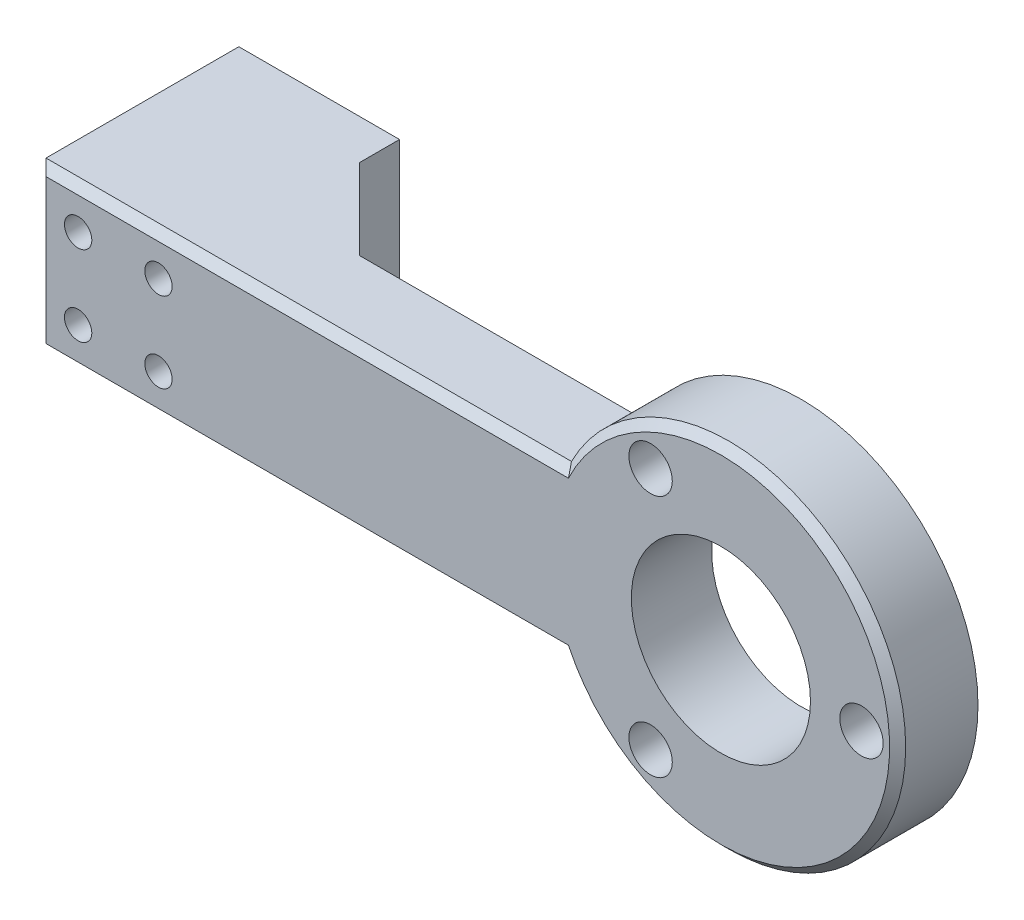
ISO-10303-21;
HEADER;
FILE_DESCRIPTION(('STEP AP214'),'2;1');
FILE_NAME('part.step','',(''),(''),'','','');
FILE_SCHEMA(('AUTOMOTIVE_DESIGN { 1 0 10303 214 1 1 1 1 }'));
ENDSEC;
DATA;
#1=APPLICATION_CONTEXT('core data for automotive mechanical design processes');
#2=APPLICATION_PROTOCOL_DEFINITION('international standard','automotive_design',2000,#1);
#3=PRODUCT_CONTEXT('',#1,'mechanical');
#4=PRODUCT('Part','Part','',(#3));
#5=PRODUCT_RELATED_PRODUCT_CATEGORY('part','',(#4));
#6=PRODUCT_DEFINITION_FORMATION('','',#4);
#7=PRODUCT_DEFINITION_CONTEXT('part definition',#1,'design');
#8=PRODUCT_DEFINITION('design','',#6,#7);
#9=PRODUCT_DEFINITION_SHAPE('','',#8);
#10=(LENGTH_UNIT() NAMED_UNIT(*) SI_UNIT(.MILLI.,.METRE.));
#11=(NAMED_UNIT(*) PLANE_ANGLE_UNIT() SI_UNIT($,.RADIAN.));
#12=(NAMED_UNIT(*) SI_UNIT($,.STERADIAN.) SOLID_ANGLE_UNIT());
#13=UNCERTAINTY_MEASURE_WITH_UNIT(LENGTH_MEASURE(1.E-05),#10,'distance_accuracy_value','');
#14=(GEOMETRIC_REPRESENTATION_CONTEXT(3) GLOBAL_UNCERTAINTY_ASSIGNED_CONTEXT((#13)) GLOBAL_UNIT_ASSIGNED_CONTEXT((#10,
#11,#12)) REPRESENTATION_CONTEXT('',''));
#15=CARTESIAN_POINT('',(0.,0.,0.));
#16=DIRECTION('',(0.,0.,1.));
#17=DIRECTION('',(1.,0.,0.));
#18=AXIS2_PLACEMENT_3D('',#15,#16,#17);
#19=CARTESIAN_POINT('',(0.,0.,0.));
#20=DIRECTION('',(0.,0.,1.));
#21=DIRECTION('',(1.,0.,0.));
#22=AXIS2_PLACEMENT_3D('',#19,#20,#21);
#23=PLANE('',#22);
#24=CARTESIAN_POINT('',(-8.74999999999982,15.1554445662278,0.));
#25=DIRECTION('',(0.,0.,1.));
#26=DIRECTION('',(1.,0.,0.));
#27=AXIS2_PLACEMENT_3D('',#24,#25,#26);
#28=CIRCLE('',#27,2.7);
#29=CARTESIAN_POINT('',(-6.04999999999981,15.1554445662278,0.));
#30=VERTEX_POINT('',#29);
#31=EDGE_CURVE('E152',#30,#30,#28,.T.);
#32=ORIENTED_EDGE('',*,*,#31,.T.);
#33=EDGE_LOOP('',(#32));
#34=FACE_BOUND('',#33,.T.);
#35=CARTESIAN_POINT('',(17.5,0.,0.));
#36=DIRECTION('',(0.,0.,1.));
#37=DIRECTION('',(1.,0.,0.));
#38=AXIS2_PLACEMENT_3D('',#35,#36,#37);
#39=CIRCLE('',#38,2.7);
#40=CARTESIAN_POINT('',(20.2,0.,0.));
#41=VERTEX_POINT('',#40);
#42=EDGE_CURVE('E162',#41,#41,#39,.T.);
#43=ORIENTED_EDGE('',*,*,#42,.T.);
#44=EDGE_LOOP('',(#43));
#45=FACE_BOUND('',#44,.T.);
#46=CARTESIAN_POINT('',(-8.74999999999982,-15.1554445662277,0.));
#47=DIRECTION('',(0.,0.,1.));
#48=DIRECTION('',(1.,0.,0.));
#49=AXIS2_PLACEMENT_3D('',#46,#47,#48);
#50=CIRCLE('',#49,2.7);
#51=CARTESIAN_POINT('',(-6.04999999999981,-15.1554445662277,0.));
#52=VERTEX_POINT('',#51);
#53=EDGE_CURVE('E168',#52,#52,#50,.T.);
#54=ORIENTED_EDGE('',*,*,#53,.T.);
#55=EDGE_LOOP('',(#54));
#56=FACE_BOUND('',#55,.T.);
#57=CARTESIAN_POINT('',(0.,0.,0.));
#58=DIRECTION('',(0.,0.,1.));
#59=DIRECTION('',(1.,0.,0.));
#60=AXIS2_PLACEMENT_3D('',#57,#58,#59);
#61=CIRCLE('',#60,11.15);
#62=CARTESIAN_POINT('',(11.15,0.,0.));
#63=VERTEX_POINT('',#62);
#64=EDGE_CURVE('E174',#63,#63,#61,.T.);
#65=ORIENTED_EDGE('',*,*,#64,.T.);
#66=EDGE_LOOP('',(#65));
#67=FACE_BOUND('',#66,.T.);
#68=DIRECTION('',(1.,0.,0.));
#69=VECTOR('',#68,1.);
#70=CARTESIAN_POINT('',(0.,-10.,0.));
#71=LINE('',#70,#69);
#72=CARTESIAN_POINT('',(-55.,-10.,0.));
#73=VERTEX_POINT('',#72);
#74=CARTESIAN_POINT('',(-19.5959179422654,-10.,0.));
#75=VERTEX_POINT('',#74);
#76=EDGE_CURVE('E148',#73,#75,#71,.T.);
#77=ORIENTED_EDGE('',*,*,#76,.F.);
#78=DIRECTION('',(0.,1.,0.));
#79=VECTOR('',#78,1.);
#80=CARTESIAN_POINT('',(-55.,10.,0.));
#81=LINE('',#80,#79);
#82=CARTESIAN_POINT('',(-55.,10.,0.));
#83=VERTEX_POINT('',#82);
#84=EDGE_CURVE('E188',#73,#83,#81,.T.);
#85=ORIENTED_EDGE('',*,*,#84,.T.);
#86=DIRECTION('',(1.,0.,0.));
#87=VECTOR('',#86,1.);
#88=CARTESIAN_POINT('',(0.,10.,0.));
#89=LINE('',#88,#87);
#90=CARTESIAN_POINT('',(-19.5959179422654,10.,0.));
#91=VERTEX_POINT('',#90);
#92=EDGE_CURVE('E118',#83,#91,#89,.T.);
#93=ORIENTED_EDGE('',*,*,#92,.T.);
#94=CARTESIAN_POINT('',(0.,0.,0.));
#95=DIRECTION('',(0.,0.,1.));
#96=DIRECTION('',(1.,0.,0.));
#97=AXIS2_PLACEMENT_3D('',#94,#95,#96);
#98=CIRCLE('',#97,22.);
#99=EDGE_CURVE('E180',#75,#91,#98,.T.);
#100=ORIENTED_EDGE('',*,*,#99,.F.);
#101=EDGE_LOOP('',(#77,#85,#93,#100));
#102=FACE_BOUND('',#101,.T.);
#103=ADVANCED_FACE('F37',(#34,#45,#56,#67,#102),#23,.F.);
#104=CARTESIAN_POINT('',(0.,0.,10.));
#105=DIRECTION('',(0.,0.,1.));
#106=DIRECTION('',(1.,0.,0.));
#107=AXIS2_PLACEMENT_3D('',#104,#105,#106);
#108=PLANE('',#107);
#109=CARTESIAN_POINT('',(-80.0000000000001,-5.00000000000001,10.));
#110=DIRECTION('',(0.,0.,-1.));
#111=DIRECTION('',(1.,0.,0.));
#112=AXIS2_PLACEMENT_3D('',#109,#110,#111);
#113=CIRCLE('',#112,1.7);
#114=CARTESIAN_POINT('',(-78.3000000000001,-5.00000000000001,10.));
#115=VERTEX_POINT('',#114);
#116=EDGE_CURVE('E369',#115,#115,#113,.T.);
#117=ORIENTED_EDGE('',*,*,#116,.T.);
#118=EDGE_LOOP('',(#117));
#119=FACE_BOUND('',#118,.T.);
#120=CARTESIAN_POINT('',(-69.9999999999999,-5.00000000000001,10.));
#121=DIRECTION('',(0.,0.,-1.));
#122=DIRECTION('',(-1.,0.,0.));
#123=AXIS2_PLACEMENT_3D('',#120,#121,#122);
#124=CIRCLE('',#123,1.7);
#125=CARTESIAN_POINT('',(-71.6999999999999,-5.00000000000001,10.));
#126=VERTEX_POINT('',#125);
#127=EDGE_CURVE('E360',#126,#126,#124,.T.);
#128=ORIENTED_EDGE('',*,*,#127,.T.);
#129=EDGE_LOOP('',(#128));
#130=FACE_BOUND('',#129,.T.);
#131=CARTESIAN_POINT('',(-69.9999999999999,5.00000000000001,10.));
#132=DIRECTION('',(0.,0.,-1.));
#133=DIRECTION('',(1.,0.,0.));
#134=AXIS2_PLACEMENT_3D('',#131,#132,#133);
#135=CIRCLE('',#134,1.7);
#136=CARTESIAN_POINT('',(-68.2999999999999,5.00000000000001,10.));
#137=VERTEX_POINT('',#136);
#138=EDGE_CURVE('E355',#137,#137,#135,.T.);
#139=ORIENTED_EDGE('',*,*,#138,.T.);
#140=EDGE_LOOP('',(#139));
#141=FACE_BOUND('',#140,.T.);
#142=CARTESIAN_POINT('',(-80.0000000000001,5.00000000000001,10.));
#143=DIRECTION('',(0.,0.,-1.));
#144=DIRECTION('',(-1.,0.,0.));
#145=AXIS2_PLACEMENT_3D('',#142,#143,#144);
#146=CIRCLE('',#145,1.7);
#147=CARTESIAN_POINT('',(-81.7000000000001,5.00000000000001,10.));
#148=VERTEX_POINT('',#147);
#149=EDGE_CURVE('E215',#148,#148,#146,.T.);
#150=ORIENTED_EDGE('',*,*,#149,.T.);
#151=EDGE_LOOP('',(#150));
#152=FACE_BOUND('',#151,.T.);
#153=DIRECTION('',(-1.,0.,0.));
#154=VECTOR('',#153,1.);
#155=CARTESIAN_POINT('',(-85.,9.00000000000004,10.));
#156=LINE('',#155,#154);
#157=CARTESIAN_POINT('',(-18.9736659610102,9.00000000000004,10.));
#158=VERTEX_POINT('',#157);
#159=CARTESIAN_POINT('',(-84.,9.00000000000004,10.));
#160=VERTEX_POINT('',#159);
#161=EDGE_CURVE('E196',#158,#160,#156,.T.);
#162=ORIENTED_EDGE('',*,*,#161,.T.);
#163=DIRECTION('',(0.,-1.,0.));
#164=VECTOR('',#163,1.);
#165=CARTESIAN_POINT('',(-84.,0.,10.));
#166=LINE('',#165,#164);
#167=CARTESIAN_POINT('',(-84.,-9.00000000000004,10.));
#168=VERTEX_POINT('',#167);
#169=EDGE_CURVE('E207',#160,#168,#166,.T.);
#170=ORIENTED_EDGE('',*,*,#169,.T.);
#171=DIRECTION('',(1.,0.,0.));
#172=VECTOR('',#171,1.);
#173=CARTESIAN_POINT('',(0.,-9.00000000000004,10.));
#174=LINE('',#173,#172);
#175=CARTESIAN_POINT('',(-18.9736659610102,-9.00000000000004,10.));
#176=VERTEX_POINT('',#175);
#177=EDGE_CURVE('E198',#168,#176,#174,.T.);
#178=ORIENTED_EDGE('',*,*,#177,.T.);
#179=CARTESIAN_POINT('',(0.,0.,10.));
#180=DIRECTION('',(0.,0.,1.));
#181=DIRECTION('',(1.,0.,0.));
#182=AXIS2_PLACEMENT_3D('',#179,#180,#181);
#183=CIRCLE('',#182,21.);
#184=EDGE_CURVE('E194',#176,#158,#183,.T.);
#185=ORIENTED_EDGE('',*,*,#184,.T.);
#186=EDGE_LOOP('',(#162,#170,#178,#185));
#187=FACE_BOUND('',#186,.T.);
#188=CARTESIAN_POINT('',(17.5,0.,10.));
#189=DIRECTION('',(0.,0.,1.));
#190=DIRECTION('',(1.,0.,0.));
#191=AXIS2_PLACEMENT_3D('',#188,#189,#190);
#192=CIRCLE('',#191,2.7);
#193=CARTESIAN_POINT('',(20.2,0.,10.));
#194=VERTEX_POINT('',#193);
#195=EDGE_CURVE('E165',#194,#194,#192,.T.);
#196=ORIENTED_EDGE('',*,*,#195,.F.);
#197=EDGE_LOOP('',(#196));
#198=FACE_BOUND('',#197,.T.);
#199=CARTESIAN_POINT('',(0.,0.,10.));
#200=DIRECTION('',(0.,0.,1.));
#201=DIRECTION('',(1.,0.,0.));
#202=AXIS2_PLACEMENT_3D('',#199,#200,#201);
#203=CIRCLE('',#202,11.15);
#204=CARTESIAN_POINT('',(11.15,0.,10.));
#205=VERTEX_POINT('',#204);
#206=EDGE_CURVE('E177',#205,#205,#203,.T.);
#207=ORIENTED_EDGE('',*,*,#206,.F.);
#208=EDGE_LOOP('',(#207));
#209=FACE_BOUND('',#208,.T.);
#210=CARTESIAN_POINT('',(-8.74999999999982,-15.1554445662277,10.));
#211=DIRECTION('',(0.,0.,1.));
#212=DIRECTION('',(1.,0.,0.));
#213=AXIS2_PLACEMENT_3D('',#210,#211,#212);
#214=CIRCLE('',#213,2.7);
#215=CARTESIAN_POINT('',(-6.04999999999981,-15.1554445662277,10.));
#216=VERTEX_POINT('',#215);
#217=EDGE_CURVE('E171',#216,#216,#214,.T.);
#218=ORIENTED_EDGE('',*,*,#217,.F.);
#219=EDGE_LOOP('',(#218));
#220=FACE_BOUND('',#219,.T.);
#221=CARTESIAN_POINT('',(-8.74999999999982,15.1554445662278,10.));
#222=DIRECTION('',(0.,0.,1.));
#223=DIRECTION('',(1.,0.,0.));
#224=AXIS2_PLACEMENT_3D('',#221,#222,#223);
#225=CIRCLE('',#224,2.7);
#226=CARTESIAN_POINT('',(-6.04999999999981,15.1554445662278,10.));
#227=VERTEX_POINT('',#226);
#228=EDGE_CURVE('E159',#227,#227,#225,.T.);
#229=ORIENTED_EDGE('',*,*,#228,.F.);
#230=EDGE_LOOP('',(#229));
#231=FACE_BOUND('',#230,.T.);
#232=ADVANCED_FACE('F246',(#119,#130,#141,#152,#187,#198,#209,#220,#231),#108,.T.);
#233=CARTESIAN_POINT('',(-85.,0.,0.));
#234=DIRECTION('',(-1.,0.,0.));
#235=DIRECTION('',(0.,0.,1.));
#236=AXIS2_PLACEMENT_3D('',#233,#234,#235);
#237=PLANE('',#236);
#238=DIRECTION('',(0.,0.,1.));
#239=VECTOR('',#238,1.);
#240=CARTESIAN_POINT('',(-85.,-10.,0.));
#241=LINE('',#240,#239);
#242=CARTESIAN_POINT('',(-85.,-10.,-15.));
#243=VERTEX_POINT('',#242);
#244=CARTESIAN_POINT('',(-85.,-10.,9.00000000000003));
#245=VERTEX_POINT('',#244);
#246=EDGE_CURVE('E150',#243,#245,#241,.T.);
#247=ORIENTED_EDGE('',*,*,#246,.T.);
#248=DIRECTION('',(0.,1.,0.));
#249=VECTOR('',#248,1.);
#250=CARTESIAN_POINT('',(-85.,0.,9.));
#251=LINE('',#250,#249);
#252=CARTESIAN_POINT('',(-85.,10.,9.00000000000003));
#253=VERTEX_POINT('',#252);
#254=EDGE_CURVE('E46',#245,#253,#251,.T.);
#255=ORIENTED_EDGE('',*,*,#254,.T.);
#256=DIRECTION('',(0.,0.,1.));
#257=VECTOR('',#256,1.);
#258=CARTESIAN_POINT('',(-85.,10.,0.));
#259=LINE('',#258,#257);
#260=CARTESIAN_POINT('',(-85.,10.,-15.));
#261=VERTEX_POINT('',#260);
#262=EDGE_CURVE('E110',#261,#253,#259,.T.);
#263=ORIENTED_EDGE('',*,*,#262,.F.);
#264=DIRECTION('',(0.,1.,0.));
#265=VECTOR('',#264,1.);
#266=CARTESIAN_POINT('',(-85.,-10.,-15.));
#267=LINE('',#266,#265);
#268=EDGE_CURVE('E115',#243,#261,#267,.T.);
#269=ORIENTED_EDGE('',*,*,#268,.F.);
#270=EDGE_LOOP('',(#247,#255,#263,#269));
#271=FACE_BOUND('',#270,.T.);
#272=ADVANCED_FACE('F113',(#271),#237,.T.);
#273=CARTESIAN_POINT('',(0.,0.,10.));
#274=DIRECTION('',(0.,0.,-1.));
#275=DIRECTION('',(-1.,0.,0.));
#276=AXIS2_PLACEMENT_3D('',#273,#274,#275);
#277=CYLINDRICAL_SURFACE('',#276,22.);
#278=DIRECTION('',(0.,0.,1.));
#279=VECTOR('',#278,1.);
#280=CARTESIAN_POINT('',(-19.5959179422654,10.,0.));
#281=LINE('',#280,#279);
#282=CARTESIAN_POINT('',(-19.5959179422654,10.,9.00000000000003));
#283=VERTEX_POINT('',#282);
#284=EDGE_CURVE('E117',#91,#283,#281,.T.);
#285=ORIENTED_EDGE('',*,*,#284,.T.);
#286=CARTESIAN_POINT('',(0.,0.,9.00000000000003));
#287=DIRECTION('',(0.,0.,1.));
#288=DIRECTION('',(1.,0.,0.));
#289=AXIS2_PLACEMENT_3D('',#286,#287,#288);
#290=CIRCLE('',#289,22.);
#291=CARTESIAN_POINT('',(-19.5959179422654,-10.,9.00000000000003));
#292=VERTEX_POINT('',#291);
#293=EDGE_CURVE('E205',#283,#292,#290,.F.);
#294=ORIENTED_EDGE('',*,*,#293,.T.);
#295=DIRECTION('',(0.,0.,1.));
#296=VECTOR('',#295,1.);
#297=CARTESIAN_POINT('',(-19.5959179422654,-10.,0.));
#298=LINE('',#297,#296);
#299=EDGE_CURVE('E155',#75,#292,#298,.T.);
#300=ORIENTED_EDGE('',*,*,#299,.F.);
#301=ORIENTED_EDGE('',*,*,#99,.T.);
#302=EDGE_LOOP('',(#285,#294,#300,#301));
#303=FACE_BOUND('',#302,.T.);
#304=ADVANCED_FACE('F257',(#303),#277,.T.);
#305=CARTESIAN_POINT('',(0.,0.,10.));
#306=DIRECTION('',(0.,0.,-1.));
#307=DIRECTION('',(-1.,0.,0.));
#308=AXIS2_PLACEMENT_3D('',#305,#306,#307);
#309=CYLINDRICAL_SURFACE('',#308,11.15);
#310=ORIENTED_EDGE('',*,*,#206,.T.);
#311=EDGE_LOOP('',(#310));
#312=FACE_BOUND('',#311,.T.);
#313=ORIENTED_EDGE('',*,*,#64,.F.);
#314=EDGE_LOOP('',(#313));
#315=FACE_BOUND('',#314,.T.);
#316=ADVANCED_FACE('F259',(#312,#315),#309,.F.);
#317=CARTESIAN_POINT('',(-8.74999999999982,-15.1554445662277,10.));
#318=DIRECTION('',(0.,0.,-1.));
#319=DIRECTION('',(-1.,0.,0.));
#320=AXIS2_PLACEMENT_3D('',#317,#318,#319);
#321=CYLINDRICAL_SURFACE('',#320,2.7);
#322=ORIENTED_EDGE('',*,*,#217,.T.);
#323=EDGE_LOOP('',(#322));
#324=FACE_BOUND('',#323,.T.);
#325=ORIENTED_EDGE('',*,*,#53,.F.);
#326=EDGE_LOOP('',(#325));
#327=FACE_BOUND('',#326,.T.);
#328=ADVANCED_FACE('F267',(#324,#327),#321,.F.);
#329=CARTESIAN_POINT('',(17.5,0.,10.));
#330=DIRECTION('',(0.,0.,-1.));
#331=DIRECTION('',(-1.,0.,0.));
#332=AXIS2_PLACEMENT_3D('',#329,#330,#331);
#333=CYLINDRICAL_SURFACE('',#332,2.7);
#334=ORIENTED_EDGE('',*,*,#195,.T.);
#335=EDGE_LOOP('',(#334));
#336=FACE_BOUND('',#335,.T.);
#337=ORIENTED_EDGE('',*,*,#42,.F.);
#338=EDGE_LOOP('',(#337));
#339=FACE_BOUND('',#338,.T.);
#340=ADVANCED_FACE('F297',(#336,#339),#333,.F.);
#341=CARTESIAN_POINT('',(-8.74999999999982,15.1554445662278,10.));
#342=DIRECTION('',(0.,0.,-1.));
#343=DIRECTION('',(-1.,0.,0.));
#344=AXIS2_PLACEMENT_3D('',#341,#342,#343);
#345=CYLINDRICAL_SURFACE('',#344,2.7);
#346=ORIENTED_EDGE('',*,*,#228,.T.);
#347=EDGE_LOOP('',(#346));
#348=FACE_BOUND('',#347,.T.);
#349=ORIENTED_EDGE('',*,*,#31,.F.);
#350=EDGE_LOOP('',(#349));
#351=FACE_BOUND('',#350,.T.);
#352=ADVANCED_FACE('F294',(#348,#351),#345,.F.);
#353=CARTESIAN_POINT('',(0.,-10.,0.));
#354=DIRECTION('',(0.,-1.,0.));
#355=DIRECTION('',(0.,0.,-1.));
#356=AXIS2_PLACEMENT_3D('',#353,#354,#355);
#357=PLANE('',#356);
#358=ORIENTED_EDGE('',*,*,#299,.T.);
#359=DIRECTION('',(-1.,0.,0.));
#360=VECTOR('',#359,1.);
#361=CARTESIAN_POINT('',(0.,-10.,9.00000000000003));
#362=LINE('',#361,#360);
#363=EDGE_CURVE('E200',#292,#245,#362,.T.);
#364=ORIENTED_EDGE('',*,*,#363,.T.);
#365=ORIENTED_EDGE('',*,*,#246,.F.);
#366=DIRECTION('',(-1.,0.,0.));
#367=VECTOR('',#366,1.);
#368=CARTESIAN_POINT('',(-85.,-10.,-15.));
#369=LINE('',#368,#367);
#370=CARTESIAN_POINT('',(-65.,-10.,-15.));
#371=VERTEX_POINT('',#370);
#372=EDGE_CURVE('E132',#371,#243,#369,.T.);
#373=ORIENTED_EDGE('',*,*,#372,.F.);
#374=DIRECTION('',(0.,0.,1.));
#375=VECTOR('',#374,1.);
#376=CARTESIAN_POINT('',(-65.,-10.,-15.));
#377=LINE('',#376,#375);
#378=CARTESIAN_POINT('',(-65.,-10.,-10.0000000000001));
#379=VERTEX_POINT('',#378);
#380=EDGE_CURVE('E144',#371,#379,#377,.T.);
#381=ORIENTED_EDGE('',*,*,#380,.T.);
#382=DIRECTION('',(-0.707106781186544,0.,-0.707106781186551));
#383=VECTOR('',#382,1.);
#384=CARTESIAN_POINT('',(-65.,-10.,-10.0000000000001));
#385=LINE('',#384,#383);
#386=EDGE_CURVE('E190',#379,#73,#385,.F.);
#387=ORIENTED_EDGE('',*,*,#386,.T.);
#388=ORIENTED_EDGE('',*,*,#76,.T.);
#389=EDGE_LOOP('',(#358,#364,#365,#373,#381,#387,#388));
#390=FACE_BOUND('',#389,.T.);
#391=ADVANCED_FACE('F282',(#390),#357,.T.);
#392=CARTESIAN_POINT('',(0.,10.,0.));
#393=DIRECTION('',(0.,-1.,0.));
#394=DIRECTION('',(0.,0.,-1.));
#395=AXIS2_PLACEMENT_3D('',#392,#393,#394);
#396=PLANE('',#395);
#397=ORIENTED_EDGE('',*,*,#262,.T.);
#398=DIRECTION('',(1.,0.,0.));
#399=VECTOR('',#398,1.);
#400=CARTESIAN_POINT('',(-19.5959179422654,10.,9.00000000000003));
#401=LINE('',#400,#399);
#402=EDGE_CURVE('E203',#253,#283,#401,.T.);
#403=ORIENTED_EDGE('',*,*,#402,.T.);
#404=ORIENTED_EDGE('',*,*,#284,.F.);
#405=ORIENTED_EDGE('',*,*,#92,.F.);
#406=DIRECTION('',(0.707106781186544,0.,0.707106781186551));
#407=VECTOR('',#406,1.);
#408=CARTESIAN_POINT('',(-27.5000000000003,10.,27.5));
#409=LINE('',#408,#407);
#410=CARTESIAN_POINT('',(-65.,10.,-10.0000000000001));
#411=VERTEX_POINT('',#410);
#412=EDGE_CURVE('E192',#83,#411,#409,.F.);
#413=ORIENTED_EDGE('',*,*,#412,.T.);
#414=DIRECTION('',(0.,0.,1.));
#415=VECTOR('',#414,1.);
#416=CARTESIAN_POINT('',(-65.,10.,-15.));
#417=LINE('',#416,#415);
#418=CARTESIAN_POINT('',(-65.,10.,-15.));
#419=VERTEX_POINT('',#418);
#420=EDGE_CURVE('E124',#419,#411,#417,.T.);
#421=ORIENTED_EDGE('',*,*,#420,.F.);
#422=DIRECTION('',(1.,0.,0.));
#423=VECTOR('',#422,1.);
#424=CARTESIAN_POINT('',(-85.,10.,-15.));
#425=LINE('',#424,#423);
#426=EDGE_CURVE('E121',#261,#419,#425,.T.);
#427=ORIENTED_EDGE('',*,*,#426,.F.);
#428=EDGE_LOOP('',(#397,#403,#404,#405,#413,#421,#427));
#429=FACE_BOUND('',#428,.T.);
#430=ADVANCED_FACE('F122',(#429),#396,.F.);
#431=CARTESIAN_POINT('',(-65.,-10.,-15.));
#432=DIRECTION('',(-1.,0.,0.));
#433=DIRECTION('',(0.,0.,1.));
#434=AXIS2_PLACEMENT_3D('',#431,#432,#433);
#435=PLANE('',#434);
#436=ORIENTED_EDGE('',*,*,#420,.T.);
#437=DIRECTION('',(0.,-1.,0.));
#438=VECTOR('',#437,1.);
#439=CARTESIAN_POINT('',(-65.,-10.,-10.0000000000001));
#440=LINE('',#439,#438);
#441=EDGE_CURVE('E185',#411,#379,#440,.T.);
#442=ORIENTED_EDGE('',*,*,#441,.T.);
#443=ORIENTED_EDGE('',*,*,#380,.F.);
#444=DIRECTION('',(0.,-1.,0.));
#445=VECTOR('',#444,1.);
#446=CARTESIAN_POINT('',(-65.,-10.,-15.));
#447=LINE('',#446,#445);
#448=EDGE_CURVE('E127',#419,#371,#447,.T.);
#449=ORIENTED_EDGE('',*,*,#448,.F.);
#450=EDGE_LOOP('',(#436,#442,#443,#449));
#451=FACE_BOUND('',#450,.T.);
#452=ADVANCED_FACE('F323',(#451),#435,.F.);
#453=CARTESIAN_POINT('',(0.,0.,-15.));
#454=DIRECTION('',(0.,0.,-1.));
#455=DIRECTION('',(-1.,0.,0.));
#456=AXIS2_PLACEMENT_3D('',#453,#454,#455);
#457=PLANE('',#456);
#458=CARTESIAN_POINT('',(-80.0000000000001,-5.00000000000001,-15.));
#459=DIRECTION('',(0.,0.,-1.));
#460=DIRECTION('',(1.,0.,0.));
#461=AXIS2_PLACEMENT_3D('',#458,#459,#460);
#462=CIRCLE('',#461,1.7);
#463=CARTESIAN_POINT('',(-78.3000000000001,-5.00000000000001,-15.));
#464=VERTEX_POINT('',#463);
#465=EDGE_CURVE('E372',#464,#464,#462,.T.);
#466=ORIENTED_EDGE('',*,*,#465,.F.);
#467=EDGE_LOOP('',(#466));
#468=FACE_BOUND('',#467,.T.);
#469=CARTESIAN_POINT('',(-69.9999999999999,-5.00000000000001,-15.));
#470=DIRECTION('',(0.,0.,-1.));
#471=DIRECTION('',(-1.,0.,0.));
#472=AXIS2_PLACEMENT_3D('',#469,#470,#471);
#473=CIRCLE('',#472,1.7);
#474=CARTESIAN_POINT('',(-71.6999999999999,-5.00000000000001,-15.));
#475=VERTEX_POINT('',#474);
#476=EDGE_CURVE('E364',#475,#475,#473,.T.);
#477=ORIENTED_EDGE('',*,*,#476,.F.);
#478=EDGE_LOOP('',(#477));
#479=FACE_BOUND('',#478,.T.);
#480=CARTESIAN_POINT('',(-69.9999999999999,5.00000000000001,-15.));
#481=DIRECTION('',(0.,0.,-1.));
#482=DIRECTION('',(1.,0.,0.));
#483=AXIS2_PLACEMENT_3D('',#480,#481,#482);
#484=CIRCLE('',#483,1.7);
#485=CARTESIAN_POINT('',(-68.2999999999999,5.00000000000001,-15.));
#486=VERTEX_POINT('',#485);
#487=EDGE_CURVE('E358',#486,#486,#484,.T.);
#488=ORIENTED_EDGE('',*,*,#487,.F.);
#489=EDGE_LOOP('',(#488));
#490=FACE_BOUND('',#489,.T.);
#491=CARTESIAN_POINT('',(-80.0000000000001,5.00000000000001,-15.));
#492=DIRECTION('',(0.,0.,-1.));
#493=DIRECTION('',(-1.,0.,0.));
#494=AXIS2_PLACEMENT_3D('',#491,#492,#493);
#495=CIRCLE('',#494,1.7);
#496=CARTESIAN_POINT('',(-81.7000000000001,5.00000000000001,-15.));
#497=VERTEX_POINT('',#496);
#498=EDGE_CURVE('E139',#497,#497,#495,.T.);
#499=ORIENTED_EDGE('',*,*,#498,.F.);
#500=EDGE_LOOP('',(#499));
#501=FACE_BOUND('',#500,.T.);
#502=ORIENTED_EDGE('',*,*,#268,.T.);
#503=ORIENTED_EDGE('',*,*,#426,.T.);
#504=ORIENTED_EDGE('',*,*,#448,.T.);
#505=ORIENTED_EDGE('',*,*,#372,.T.);
#506=EDGE_LOOP('',(#502,#503,#504,#505));
#507=FACE_BOUND('',#506,.T.);
#508=ADVANCED_FACE('F130',(#468,#479,#490,#501,#507),#457,.T.);
#509=CARTESIAN_POINT('',(-65.,-10.,-10.0000000000001));
#510=DIRECTION('',(0.707106781186551,0.,-0.707106781186544));
#511=DIRECTION('',(0.,1.,0.));
#512=AXIS2_PLACEMENT_3D('',#509,#510,#511);
#513=PLANE('',#512);
#514=ORIENTED_EDGE('',*,*,#412,.F.);
#515=ORIENTED_EDGE('',*,*,#84,.F.);
#516=ORIENTED_EDGE('',*,*,#386,.F.);
#517=ORIENTED_EDGE('',*,*,#441,.F.);
#518=EDGE_LOOP('',(#514,#515,#516,#517));
#519=FACE_BOUND('',#518,.T.);
#520=ADVANCED_FACE('F240',(#519),#513,.T.);
#521=CARTESIAN_POINT('',(0.,10.,9.00000000000003));
#522=DIRECTION('',(0.,0.70710678118655,0.707106781186545));
#523=DIRECTION('',(-1.,0.,0.));
#524=AXIS2_PLACEMENT_3D('',#521,#522,#523);
#525=PLANE('',#524);
#526=ORIENTED_EDGE('',*,*,#402,.F.);
#527=DIRECTION('',(-0.577350269189633,0.57735026918962,-0.577350269189624));
#528=VECTOR('',#527,1.);
#529=CARTESIAN_POINT('',(-56.666666666666,-18.3333333333334,37.3333333333336));
#530=LINE('',#529,#528);
#531=EDGE_CURVE('E11',#253,#160,#530,.F.);
#532=ORIENTED_EDGE('',*,*,#531,.T.);
#533=ORIENTED_EDGE('',*,*,#161,.F.);
#534=CARTESIAN_POINT('',(-19.5959179422654,10.,9.00000000000003));
#535=CARTESIAN_POINT('',(-19.4936110097761,9.83289725928098,9.16710274071905));
#536=CARTESIAN_POINT('',(-19.3906032225679,9.66601257268033,9.33398742731971));
#537=CARTESIAN_POINT('',(-19.1831858960594,9.33267923916764,9.6673207608324));
#538=CARTESIAN_POINT('',(-19.0787763561825,9.16623059243497,9.83376940756506));
#539=CARTESIAN_POINT('',(-18.9736659610102,9.00000000000004,10.));
#540=B_SPLINE_CURVE_WITH_KNOTS('',3,(#534,#535,#536,#537,#538,#539),.UNSPECIFIED.,.F.,.F.,(4,2,
4),(0.,0.772531172977622,1.54506266368858),.UNSPECIFIED.);
#541=EDGE_CURVE('E133',#283,#158,#540,.T.);
#542=ORIENTED_EDGE('',*,*,#541,.F.);
#543=EDGE_LOOP('',(#526,#532,#533,#542));
#544=FACE_BOUND('',#543,.T.);
#545=ADVANCED_FACE('F232',(#544),#525,.T.);
#546=CARTESIAN_POINT('',(0.,0.,10.));
#547=DIRECTION('',(0.,0.,-1.));
#548=DIRECTION('',(-1.,0.,0.));
#549=AXIS2_PLACEMENT_3D('',#546,#547,#548);
#550=CONICAL_SURFACE('',#549,21.,0.785398163397445);
#551=ORIENTED_EDGE('',*,*,#541,.T.);
#552=ORIENTED_EDGE('',*,*,#184,.F.);
#553=CARTESIAN_POINT('',(-18.9736659610102,-9.00000000000004,10.));
#554=CARTESIAN_POINT('',(-19.0787763561825,-9.16623059243497,9.83376940756507));
#555=CARTESIAN_POINT('',(-19.1831858960594,-9.33267923916764,9.6673207608324));
#556=CARTESIAN_POINT('',(-19.3906032225679,-9.66601257268033,9.33398742731971));
#557=CARTESIAN_POINT('',(-19.4936110097761,-9.83289725928099,9.16710274071905));
#558=CARTESIAN_POINT('',(-19.5959179422653,-10.,9.00000000000002));
#559=B_SPLINE_CURVE_WITH_KNOTS('',3,(#553,#554,#555,#556,#557,#558),.UNSPECIFIED.,.F.,.F.,(4,2,
4),(0.,0.772531490710955,1.54506266368858),.UNSPECIFIED.);
#560=EDGE_CURVE('E136',#292,#176,#559,.F.);
#561=ORIENTED_EDGE('',*,*,#560,.F.);
#562=ORIENTED_EDGE('',*,*,#293,.F.);
#563=EDGE_LOOP('',(#551,#552,#561,#562));
#564=FACE_BOUND('',#563,.T.);
#565=ADVANCED_FACE('F226',(#564),#550,.T.);
#566=CARTESIAN_POINT('',(0.,-9.00000000000004,10.));
#567=DIRECTION('',(0.,0.70710678118655,-0.707106781186545));
#568=DIRECTION('',(1.,0.,0.));
#569=AXIS2_PLACEMENT_3D('',#566,#567,#568);
#570=PLANE('',#569);
#571=ORIENTED_EDGE('',*,*,#177,.F.);
#572=DIRECTION('',(-0.577350269189633,-0.57735026918962,-0.577350269189624));
#573=VECTOR('',#572,1.);
#574=CARTESIAN_POINT('',(-55.9999999999993,19.,38.0000000000003));
#575=LINE('',#574,#573);
#576=EDGE_CURVE('E59',#168,#245,#575,.T.);
#577=ORIENTED_EDGE('',*,*,#576,.T.);
#578=ORIENTED_EDGE('',*,*,#363,.F.);
#579=ORIENTED_EDGE('',*,*,#560,.T.);
#580=EDGE_LOOP('',(#571,#577,#578,#579));
#581=FACE_BOUND('',#580,.T.);
#582=ADVANCED_FACE('F222',(#581),#570,.F.);
#583=CARTESIAN_POINT('',(-80.0000000000001,5.00000000000001,10.));
#584=DIRECTION('',(0.,0.,-1.));
#585=DIRECTION('',(-1.,0.,0.));
#586=AXIS2_PLACEMENT_3D('',#583,#584,#585);
#587=CYLINDRICAL_SURFACE('',#586,1.7);
#588=ORIENTED_EDGE('',*,*,#149,.F.);
#589=EDGE_LOOP('',(#588));
#590=FACE_BOUND('',#589,.T.);
#591=ORIENTED_EDGE('',*,*,#498,.T.);
#592=EDGE_LOOP('',(#591));
#593=FACE_BOUND('',#592,.T.);
#594=ADVANCED_FACE('F335',(#590,#593),#587,.F.);
#595=CARTESIAN_POINT('',(-69.9999999999999,5.00000000000001,10.));
#596=DIRECTION('',(0.,0.,-1.));
#597=DIRECTION('',(-1.,0.,0.));
#598=AXIS2_PLACEMENT_3D('',#595,#596,#597);
#599=CYLINDRICAL_SURFACE('',#598,1.7);
#600=ORIENTED_EDGE('',*,*,#138,.F.);
#601=EDGE_LOOP('',(#600));
#602=FACE_BOUND('',#601,.T.);
#603=ORIENTED_EDGE('',*,*,#487,.T.);
#604=EDGE_LOOP('',(#603));
#605=FACE_BOUND('',#604,.T.);
#606=ADVANCED_FACE('F338',(#602,#605),#599,.F.);
#607=CARTESIAN_POINT('',(-69.9999999999999,-5.00000000000001,10.));
#608=DIRECTION('',(0.,0.,-1.));
#609=DIRECTION('',(-1.,0.,0.));
#610=AXIS2_PLACEMENT_3D('',#607,#608,#609);
#611=CYLINDRICAL_SURFACE('',#610,1.7);
#612=ORIENTED_EDGE('',*,*,#127,.F.);
#613=EDGE_LOOP('',(#612));
#614=FACE_BOUND('',#613,.T.);
#615=ORIENTED_EDGE('',*,*,#476,.T.);
#616=EDGE_LOOP('',(#615));
#617=FACE_BOUND('',#616,.T.);
#618=ADVANCED_FACE('F343',(#614,#617),#611,.F.);
#619=CARTESIAN_POINT('',(-80.0000000000001,-5.00000000000001,10.));
#620=DIRECTION('',(0.,0.,-1.));
#621=DIRECTION('',(-1.,0.,0.));
#622=AXIS2_PLACEMENT_3D('',#619,#620,#621);
#623=CYLINDRICAL_SURFACE('',#622,1.7);
#624=ORIENTED_EDGE('',*,*,#116,.F.);
#625=EDGE_LOOP('',(#624));
#626=FACE_BOUND('',#625,.T.);
#627=ORIENTED_EDGE('',*,*,#465,.T.);
#628=EDGE_LOOP('',(#627));
#629=FACE_BOUND('',#628,.T.);
#630=ADVANCED_FACE('F340',(#626,#629),#623,.F.);
#631=CARTESIAN_POINT('',(-84.,0.,10.));
#632=DIRECTION('',(0.707106781186542,0.,-0.707106781186552));
#633=DIRECTION('',(0.,-1.,0.));
#634=AXIS2_PLACEMENT_3D('',#631,#632,#633);
#635=PLANE('',#634);
#636=ORIENTED_EDGE('',*,*,#531,.F.);
#637=ORIENTED_EDGE('',*,*,#254,.F.);
#638=ORIENTED_EDGE('',*,*,#576,.F.);
#639=ORIENTED_EDGE('',*,*,#169,.F.);
#640=EDGE_LOOP('',(#636,#637,#638,#639));
#641=FACE_BOUND('',#640,.T.);
#642=ADVANCED_FACE('F40',(#641),#635,.F.);
#643=CLOSED_SHELL('',(#103,#232,#272,#304,#316,#328,#340,#352,#391,#430,#452,#508,#520,#545,
#565,#582,#594,#606,#618,#630,#642));
#644=MANIFOLD_SOLID_BREP('B2',#643);
#645=ADVANCED_BREP_SHAPE_REPRESENTATION('',(#18,#644),#14);
#646=SHAPE_DEFINITION_REPRESENTATION(#9,#645);
ENDSEC;
END-ISO-10303-21;
